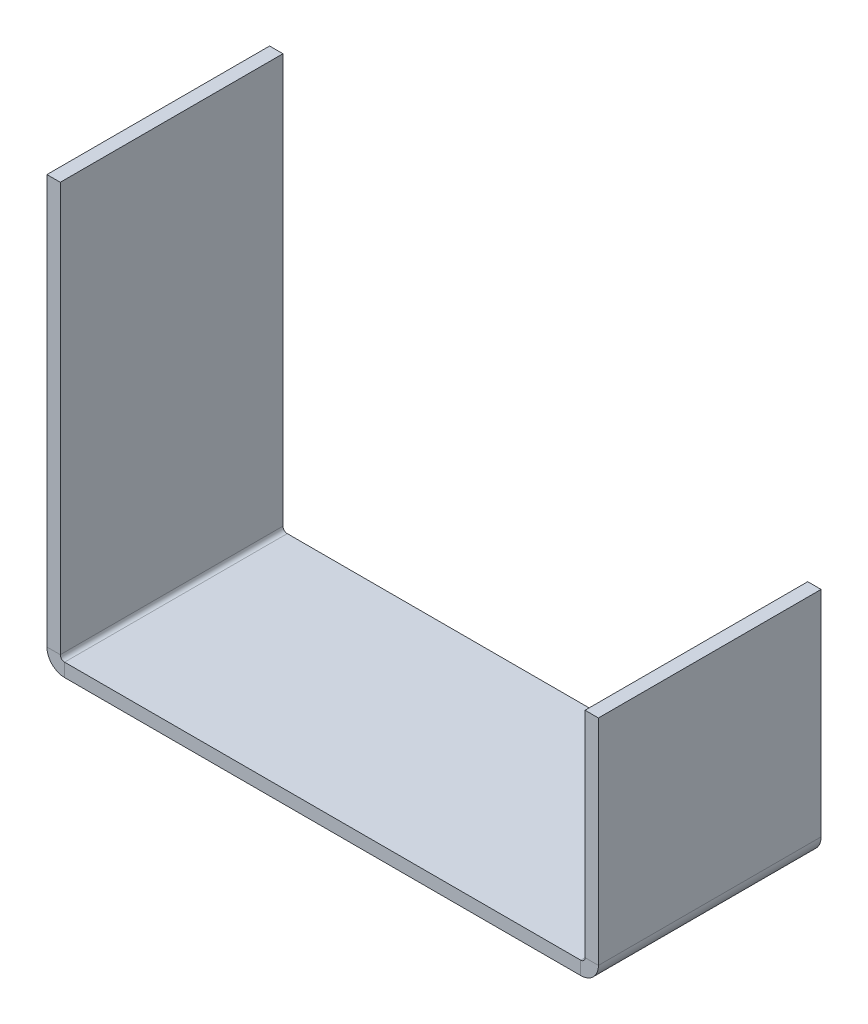
ISO-10303-21;
HEADER;
FILE_DESCRIPTION(('STEP AP214'),'2;1');
FILE_NAME('part.step','',(''),(''),'','','');
FILE_SCHEMA(('AUTOMOTIVE_DESIGN { 1 0 10303 214 1 1 1 1 }'));
ENDSEC;
DATA;
#1=APPLICATION_CONTEXT('core data for automotive mechanical design processes');
#2=APPLICATION_PROTOCOL_DEFINITION('international standard','automotive_design',2000,#1);
#3=PRODUCT_CONTEXT('',#1,'mechanical');
#4=PRODUCT('Part','Part','',(#3));
#5=PRODUCT_RELATED_PRODUCT_CATEGORY('part','',(#4));
#6=PRODUCT_DEFINITION_FORMATION('','',#4);
#7=PRODUCT_DEFINITION_CONTEXT('part definition',#1,'design');
#8=PRODUCT_DEFINITION('design','',#6,#7);
#9=PRODUCT_DEFINITION_SHAPE('','',#8);
#10=(LENGTH_UNIT() NAMED_UNIT(*) SI_UNIT(.MILLI.,.METRE.));
#11=(NAMED_UNIT(*) PLANE_ANGLE_UNIT() SI_UNIT($,.RADIAN.));
#12=(NAMED_UNIT(*) SI_UNIT($,.STERADIAN.) SOLID_ANGLE_UNIT());
#13=UNCERTAINTY_MEASURE_WITH_UNIT(LENGTH_MEASURE(1.E-05),#10,'distance_accuracy_value','');
#14=(GEOMETRIC_REPRESENTATION_CONTEXT(3) GLOBAL_UNCERTAINTY_ASSIGNED_CONTEXT((#13)) GLOBAL_UNIT_ASSIGNED_CONTEXT((#10,
#11,#12)) REPRESENTATION_CONTEXT('',''));
#15=CARTESIAN_POINT('',(0.,0.,0.));
#16=DIRECTION('',(0.,0.,1.));
#17=DIRECTION('',(1.,0.,0.));
#18=AXIS2_PLACEMENT_3D('',#15,#16,#17);
#19=CARTESIAN_POINT('',(0.,-2.286,0.));
#20=DIRECTION('',(0.,-1.,0.));
#21=DIRECTION('',(0.,0.,-1.));
#22=AXIS2_PLACEMENT_3D('',#19,#20,#21);
#23=PLANE('',#22);
#24=DIRECTION('',(1.,0.,0.));
#25=VECTOR('',#24,1.);
#26=CARTESIAN_POINT('',(-47.1805,-2.286,19.05));
#27=LINE('',#26,#25);
#28=CARTESIAN_POINT('',(-44.1579,-2.286,19.05));
#29=VERTEX_POINT('',#28);
#30=CARTESIAN_POINT('',(44.1579,-2.286,19.05));
#31=VERTEX_POINT('',#30);
#32=EDGE_CURVE('E13',#29,#31,#27,.T.);
#33=ORIENTED_EDGE('',*,*,#32,.F.);
#34=DIRECTION('',(0.,0.,1.));
#35=VECTOR('',#34,1.);
#36=CARTESIAN_POINT('',(-44.1579,-2.286,19.05));
#37=LINE('',#36,#35);
#38=CARTESIAN_POINT('',(-44.1579,-2.286,-19.05));
#39=VERTEX_POINT('',#38);
#40=EDGE_CURVE('E331',#29,#39,#37,.F.);
#41=ORIENTED_EDGE('',*,*,#40,.T.);
#42=DIRECTION('',(-1.,0.,0.));
#43=VECTOR('',#42,1.);
#44=CARTESIAN_POINT('',(-47.1805,-2.286,-19.05));
#45=LINE('',#44,#43);
#46=CARTESIAN_POINT('',(44.1579,-2.286,-19.05));
#47=VERTEX_POINT('',#46);
#48=EDGE_CURVE('E92',#47,#39,#45,.T.);
#49=ORIENTED_EDGE('',*,*,#48,.F.);
#50=DIRECTION('',(0.,0.,-1.));
#51=VECTOR('',#50,1.);
#52=CARTESIAN_POINT('',(44.1579,-2.286,-19.05));
#53=LINE('',#52,#51);
#54=EDGE_CURVE('E106',#47,#31,#53,.F.);
#55=ORIENTED_EDGE('',*,*,#54,.T.);
#56=EDGE_LOOP('',(#33,#41,#49,#55));
#57=FACE_BOUND('',#56,.T.);
#58=ADVANCED_FACE('F83',(#57),#23,.T.);
#59=CARTESIAN_POINT('',(0.,0.,0.));
#60=DIRECTION('',(0.,-1.,0.));
#61=DIRECTION('',(0.,0.,-1.));
#62=AXIS2_PLACEMENT_3D('',#59,#60,#61);
#63=PLANE('',#62);
#64=DIRECTION('',(0.,0.,1.));
#65=VECTOR('',#64,1.);
#66=CARTESIAN_POINT('',(-44.1579,0.,19.05));
#67=LINE('',#66,#65);
#68=CARTESIAN_POINT('',(-44.1579,0.,19.05));
#69=VERTEX_POINT('',#68);
#70=CARTESIAN_POINT('',(-44.1579,0.,-19.05));
#71=VERTEX_POINT('',#70);
#72=EDGE_CURVE('E201',#69,#71,#67,.F.);
#73=ORIENTED_EDGE('',*,*,#72,.F.);
#74=DIRECTION('',(1.,0.,0.));
#75=VECTOR('',#74,1.);
#76=CARTESIAN_POINT('',(-47.1805,0.,19.05));
#77=LINE('',#76,#75);
#78=CARTESIAN_POINT('',(44.1579,0.,19.05));
#79=VERTEX_POINT('',#78);
#80=EDGE_CURVE('E87',#69,#79,#77,.T.);
#81=ORIENTED_EDGE('',*,*,#80,.T.);
#82=DIRECTION('',(0.,0.,-1.));
#83=VECTOR('',#82,1.);
#84=CARTESIAN_POINT('',(44.1579,0.,-19.05));
#85=LINE('',#84,#83);
#86=CARTESIAN_POINT('',(44.1579,0.,-19.05));
#87=VERTEX_POINT('',#86);
#88=EDGE_CURVE('E150',#87,#79,#85,.F.);
#89=ORIENTED_EDGE('',*,*,#88,.F.);
#90=DIRECTION('',(-1.,0.,0.));
#91=VECTOR('',#90,1.);
#92=CARTESIAN_POINT('',(-47.1805,0.,-19.05));
#93=LINE('',#92,#91);
#94=EDGE_CURVE('E189',#87,#71,#93,.T.);
#95=ORIENTED_EDGE('',*,*,#94,.T.);
#96=EDGE_LOOP('',(#73,#81,#89,#95));
#97=FACE_BOUND('',#96,.T.);
#98=ADVANCED_FACE('F198',(#97),#63,.F.);
#99=CARTESIAN_POINT('',(-47.1805,-2.286,19.05));
#100=DIRECTION('',(0.,0.,1.));
#101=DIRECTION('',(1.,0.,0.));
#102=AXIS2_PLACEMENT_3D('',#99,#100,#101);
#103=PLANE('',#102);
#104=ORIENTED_EDGE('',*,*,#80,.F.);
#105=DIRECTION('',(0.,-1.,0.));
#106=VECTOR('',#105,1.);
#107=CARTESIAN_POINT('',(-44.1579,0.,19.05));
#108=LINE('',#107,#106);
#109=EDGE_CURVE('E337',#69,#29,#108,.T.);
#110=ORIENTED_EDGE('',*,*,#109,.T.);
#111=ORIENTED_EDGE('',*,*,#32,.T.);
#112=DIRECTION('',(0.,-1.,0.));
#113=VECTOR('',#112,1.);
#114=CARTESIAN_POINT('',(44.1579,0.,19.05));
#115=LINE('',#114,#113);
#116=EDGE_CURVE('E186',#79,#31,#115,.T.);
#117=ORIENTED_EDGE('',*,*,#116,.F.);
#118=EDGE_LOOP('',(#104,#110,#111,#117));
#119=FACE_BOUND('',#118,.T.);
#120=ADVANCED_FACE('F204',(#119),#103,.T.);
#121=CARTESIAN_POINT('',(-47.1805,-2.286,-19.05));
#122=DIRECTION('',(0.,0.,-1.));
#123=DIRECTION('',(-1.,0.,0.));
#124=AXIS2_PLACEMENT_3D('',#121,#122,#123);
#125=PLANE('',#124);
#126=DIRECTION('',(0.,-1.,0.));
#127=VECTOR('',#126,1.);
#128=CARTESIAN_POINT('',(-44.1579,0.,-19.05));
#129=LINE('',#128,#127);
#130=EDGE_CURVE('E177',#71,#39,#129,.T.);
#131=ORIENTED_EDGE('',*,*,#130,.F.);
#132=ORIENTED_EDGE('',*,*,#94,.F.);
#133=DIRECTION('',(0.,-1.,0.));
#134=VECTOR('',#133,1.);
#135=CARTESIAN_POINT('',(44.1579,0.,-19.05));
#136=LINE('',#135,#134);
#137=EDGE_CURVE('E149',#87,#47,#136,.T.);
#138=ORIENTED_EDGE('',*,*,#137,.T.);
#139=ORIENTED_EDGE('',*,*,#48,.T.);
#140=EDGE_LOOP('',(#131,#132,#138,#139));
#141=FACE_BOUND('',#140,.T.);
#142=ADVANCED_FACE('F85',(#141),#125,.T.);
#143=CARTESIAN_POINT('',(44.1579,0.7366,19.05));
#144=DIRECTION('',(0.,0.,1.));
#145=DIRECTION('',(1.,0.,0.));
#146=AXIS2_PLACEMENT_3D('',#143,#144,#145);
#147=PLANE('',#146);
#148=DIRECTION('',(-1.,0.,0.));
#149=VECTOR('',#148,1.);
#150=CARTESIAN_POINT('',(47.1805,0.736599999999989,19.05));
#151=LINE('',#150,#149);
#152=CARTESIAN_POINT('',(44.8945,0.736599999999997,19.05));
#153=VERTEX_POINT('',#152);
#154=CARTESIAN_POINT('',(47.1805,0.736599999999989,19.05));
#155=VERTEX_POINT('',#154);
#156=EDGE_CURVE('E140',#153,#155,#151,.F.);
#157=ORIENTED_EDGE('',*,*,#156,.F.);
#158=CARTESIAN_POINT('',(44.1579,0.7366,19.05));
#159=DIRECTION('',(0.,0.,-1.));
#160=DIRECTION('',(-1.,0.,0.));
#161=AXIS2_PLACEMENT_3D('',#158,#159,#160);
#162=CIRCLE('',#161,0.736599999999997);
#163=EDGE_CURVE('E134',#79,#153,#162,.F.);
#164=ORIENTED_EDGE('',*,*,#163,.F.);
#165=ORIENTED_EDGE('',*,*,#116,.T.);
#166=CARTESIAN_POINT('',(44.1579,0.7366,19.05));
#167=DIRECTION('',(0.,0.,-1.));
#168=DIRECTION('',(-1.,0.,0.));
#169=AXIS2_PLACEMENT_3D('',#166,#167,#168);
#170=CIRCLE('',#169,3.0226);
#171=EDGE_CURVE('E179',#31,#155,#170,.F.);
#172=ORIENTED_EDGE('',*,*,#171,.T.);
#173=EDGE_LOOP('',(#157,#164,#165,#172));
#174=FACE_BOUND('',#173,.T.);
#175=ADVANCED_FACE('F203',(#174),#147,.T.);
#176=CARTESIAN_POINT('',(44.1579,0.7366,-19.05));
#177=DIRECTION('',(0.,0.,1.));
#178=DIRECTION('',(1.,0.,0.));
#179=AXIS2_PLACEMENT_3D('',#176,#177,#178);
#180=PLANE('',#179);
#181=CARTESIAN_POINT('',(44.1579,0.7366,-19.05));
#182=DIRECTION('',(0.,0.,-1.));
#183=DIRECTION('',(-1.,0.,0.));
#184=AXIS2_PLACEMENT_3D('',#181,#182,#183);
#185=CIRCLE('',#184,0.736599999999997);
#186=CARTESIAN_POINT('',(44.8945,0.736599999999997,-19.05));
#187=VERTEX_POINT('',#186);
#188=EDGE_CURVE('E131',#187,#87,#185,.T.);
#189=ORIENTED_EDGE('',*,*,#188,.F.);
#190=DIRECTION('',(-1.,0.,0.));
#191=VECTOR('',#190,1.);
#192=CARTESIAN_POINT('',(44.8945,0.736599999999997,-19.05));
#193=LINE('',#192,#191);
#194=CARTESIAN_POINT('',(47.1805,0.736599999999989,-19.05));
#195=VERTEX_POINT('',#194);
#196=EDGE_CURVE('E139',#187,#195,#193,.F.);
#197=ORIENTED_EDGE('',*,*,#196,.T.);
#198=CARTESIAN_POINT('',(44.1579,0.7366,-19.05));
#199=DIRECTION('',(0.,0.,-1.));
#200=DIRECTION('',(-1.,0.,0.));
#201=AXIS2_PLACEMENT_3D('',#198,#199,#200);
#202=CIRCLE('',#201,3.0226);
#203=EDGE_CURVE('E180',#195,#47,#202,.T.);
#204=ORIENTED_EDGE('',*,*,#203,.T.);
#205=ORIENTED_EDGE('',*,*,#137,.F.);
#206=EDGE_LOOP('',(#189,#197,#204,#205));
#207=FACE_BOUND('',#206,.T.);
#208=ADVANCED_FACE('F145',(#207),#180,.F.);
#209=CARTESIAN_POINT('',(44.1579,0.7366,-19.05));
#210=DIRECTION('',(0.,0.,-1.));
#211=DIRECTION('',(1.,0.,0.));
#212=AXIS2_PLACEMENT_3D('',#209,#210,#211);
#213=CYLINDRICAL_SURFACE('',#212,3.0226);
#214=ORIENTED_EDGE('',*,*,#54,.F.);
#215=ORIENTED_EDGE('',*,*,#203,.F.);
#216=DIRECTION('',(0.,0.,-1.));
#217=VECTOR('',#216,1.);
#218=CARTESIAN_POINT('',(47.1805,0.736599999999989,19.05));
#219=LINE('',#218,#217);
#220=EDGE_CURVE('E163',#195,#155,#219,.F.);
#221=ORIENTED_EDGE('',*,*,#220,.T.);
#222=ORIENTED_EDGE('',*,*,#171,.F.);
#223=EDGE_LOOP('',(#214,#215,#221,#222));
#224=FACE_BOUND('',#223,.T.);
#225=ADVANCED_FACE('F220',(#224),#213,.T.);
#226=CARTESIAN_POINT('',(44.1579,0.7366,-19.05));
#227=DIRECTION('',(0.,0.,-1.));
#228=DIRECTION('',(1.,0.,0.));
#229=AXIS2_PLACEMENT_3D('',#226,#227,#228);
#230=CYLINDRICAL_SURFACE('',#229,0.736599999999997);
#231=ORIENTED_EDGE('',*,*,#88,.T.);
#232=ORIENTED_EDGE('',*,*,#163,.T.);
#233=DIRECTION('',(0.,0.,-1.));
#234=VECTOR('',#233,1.);
#235=CARTESIAN_POINT('',(44.8945,0.736599999999997,19.05));
#236=LINE('',#235,#234);
#237=EDGE_CURVE('E127',#153,#187,#236,.T.);
#238=ORIENTED_EDGE('',*,*,#237,.T.);
#239=ORIENTED_EDGE('',*,*,#188,.T.);
#240=EDGE_LOOP('',(#231,#232,#238,#239));
#241=FACE_BOUND('',#240,.T.);
#242=ADVANCED_FACE('F130',(#241),#230,.F.);
#243=CARTESIAN_POINT('',(47.1805000000002,37.4015,-19.05));
#244=DIRECTION('',(0.,0.,1.));
#245=DIRECTION('',(0.,-1.,0.));
#246=AXIS2_PLACEMENT_3D('',#243,#244,#245);
#247=PLANE('',#246);
#248=ORIENTED_EDGE('',*,*,#196,.F.);
#249=DIRECTION('',(0.,-1.,0.));
#250=VECTOR('',#249,1.);
#251=CARTESIAN_POINT('',(44.8945000000001,37.4015,-19.05));
#252=LINE('',#251,#250);
#253=CARTESIAN_POINT('',(44.8945000000001,37.4015,-19.05));
#254=VERTEX_POINT('',#253);
#255=EDGE_CURVE('E159',#187,#254,#252,.F.);
#256=ORIENTED_EDGE('',*,*,#255,.T.);
#257=DIRECTION('',(-1.,0.,0.));
#258=VECTOR('',#257,1.);
#259=CARTESIAN_POINT('',(47.1805000000002,37.4015,-19.05));
#260=LINE('',#259,#258);
#261=CARTESIAN_POINT('',(47.1805000000001,37.4015,-19.05));
#262=VERTEX_POINT('',#261);
#263=EDGE_CURVE('E151',#262,#254,#260,.T.);
#264=ORIENTED_EDGE('',*,*,#263,.F.);
#265=DIRECTION('',(0.,1.,0.));
#266=VECTOR('',#265,1.);
#267=CARTESIAN_POINT('',(47.1805,-1.70756903369944E-13,-19.05));
#268=LINE('',#267,#266);
#269=EDGE_CURVE('E162',#195,#262,#268,.T.);
#270=ORIENTED_EDGE('',*,*,#269,.F.);
#271=EDGE_LOOP('',(#248,#256,#264,#270));
#272=FACE_BOUND('',#271,.T.);
#273=ADVANCED_FACE('F156',(#272),#247,.F.);
#274=CARTESIAN_POINT('',(47.1805,0.,19.05));
#275=DIRECTION('',(0.,0.,-1.));
#276=DIRECTION('',(-1.,0.,0.));
#277=AXIS2_PLACEMENT_3D('',#274,#275,#276);
#278=PLANE('',#277);
#279=ORIENTED_EDGE('',*,*,#156,.T.);
#280=DIRECTION('',(0.,-1.,0.));
#281=VECTOR('',#280,1.);
#282=CARTESIAN_POINT('',(47.1805,-1.74291144747146E-13,19.05));
#283=LINE('',#282,#281);
#284=CARTESIAN_POINT('',(47.1805000000001,37.4015,19.05));
#285=VERTEX_POINT('',#284);
#286=EDGE_CURVE('E354',#285,#155,#283,.T.);
#287=ORIENTED_EDGE('',*,*,#286,.F.);
#288=DIRECTION('',(-1.,0.,0.));
#289=VECTOR('',#288,1.);
#290=CARTESIAN_POINT('',(47.1805000000001,37.4015,19.05));
#291=LINE('',#290,#289);
#292=CARTESIAN_POINT('',(44.8945000000001,37.4015,19.05));
#293=VERTEX_POINT('',#292);
#294=EDGE_CURVE('E351',#285,#293,#291,.T.);
#295=ORIENTED_EDGE('',*,*,#294,.T.);
#296=DIRECTION('',(0.,1.,0.));
#297=VECTOR('',#296,1.);
#298=CARTESIAN_POINT('',(44.8945,0.,19.05));
#299=LINE('',#298,#297);
#300=EDGE_CURVE('E170',#293,#153,#299,.F.);
#301=ORIENTED_EDGE('',*,*,#300,.T.);
#302=EDGE_LOOP('',(#279,#287,#295,#301));
#303=FACE_BOUND('',#302,.T.);
#304=ADVANCED_FACE('F229',(#303),#278,.F.);
#305=CARTESIAN_POINT('',(47.1805,-1.74291144747146E-13,0.));
#306=DIRECTION('',(-1.,0.,0.));
#307=DIRECTION('',(0.,-1.,0.));
#308=AXIS2_PLACEMENT_3D('',#305,#306,#307);
#309=PLANE('',#308);
#310=ORIENTED_EDGE('',*,*,#220,.F.);
#311=ORIENTED_EDGE('',*,*,#269,.T.);
#312=DIRECTION('',(0.,0.,1.));
#313=VECTOR('',#312,1.);
#314=CARTESIAN_POINT('',(47.1805000000001,37.4015,0.));
#315=LINE('',#314,#313);
#316=EDGE_CURVE('E357',#262,#285,#315,.T.);
#317=ORIENTED_EDGE('',*,*,#316,.T.);
#318=ORIENTED_EDGE('',*,*,#286,.T.);
#319=EDGE_LOOP('',(#310,#311,#317,#318));
#320=FACE_BOUND('',#319,.T.);
#321=ADVANCED_FACE('F237',(#320),#309,.F.);
#322=CARTESIAN_POINT('',(44.8945,-1.66309618406551E-13,0.));
#323=DIRECTION('',(-1.,0.,0.));
#324=DIRECTION('',(0.,-1.,0.));
#325=AXIS2_PLACEMENT_3D('',#322,#323,#324);
#326=PLANE('',#325);
#327=ORIENTED_EDGE('',*,*,#255,.F.);
#328=ORIENTED_EDGE('',*,*,#237,.F.);
#329=ORIENTED_EDGE('',*,*,#300,.F.);
#330=DIRECTION('',(0.,0.,-1.));
#331=VECTOR('',#330,1.);
#332=CARTESIAN_POINT('',(44.8945000000001,37.4015,19.05));
#333=LINE('',#332,#331);
#334=EDGE_CURVE('E168',#254,#293,#333,.F.);
#335=ORIENTED_EDGE('',*,*,#334,.F.);
#336=EDGE_LOOP('',(#327,#328,#329,#335));
#337=FACE_BOUND('',#336,.T.);
#338=ADVANCED_FACE('F166',(#337),#326,.T.);
#339=CARTESIAN_POINT('',(47.1805000000002,37.4015,19.05));
#340=DIRECTION('',(0.,-1.,0.));
#341=DIRECTION('',(1.,0.,0.));
#342=AXIS2_PLACEMENT_3D('',#339,#340,#341);
#343=PLANE('',#342);
#344=ORIENTED_EDGE('',*,*,#334,.T.);
#345=ORIENTED_EDGE('',*,*,#294,.F.);
#346=ORIENTED_EDGE('',*,*,#316,.F.);
#347=ORIENTED_EDGE('',*,*,#263,.T.);
#348=EDGE_LOOP('',(#344,#345,#346,#347));
#349=FACE_BOUND('',#348,.T.);
#350=ADVANCED_FACE('F230',(#349),#343,.F.);
#351=CARTESIAN_POINT('',(-44.1579,0.7366,-19.05));
#352=DIRECTION('',(0.,0.,-1.));
#353=DIRECTION('',(-1.,0.,0.));
#354=AXIS2_PLACEMENT_3D('',#351,#352,#353);
#355=PLANE('',#354);
#356=DIRECTION('',(1.,0.,0.));
#357=VECTOR('',#356,1.);
#358=CARTESIAN_POINT('',(-47.1805,0.736599999999989,-19.05));
#359=LINE('',#358,#357);
#360=CARTESIAN_POINT('',(-44.8945,0.736599999999997,-19.05));
#361=VERTEX_POINT('',#360);
#362=CARTESIAN_POINT('',(-47.1805,0.736599999999989,-19.05));
#363=VERTEX_POINT('',#362);
#364=EDGE_CURVE('E328',#361,#363,#359,.F.);
#365=ORIENTED_EDGE('',*,*,#364,.F.);
#366=CARTESIAN_POINT('',(-44.1579,0.7366,-19.05));
#367=DIRECTION('',(0.,0.,1.));
#368=DIRECTION('',(1.,0.,0.));
#369=AXIS2_PLACEMENT_3D('',#366,#367,#368);
#370=CIRCLE('',#369,0.736599999999997);
#371=EDGE_CURVE('E340',#71,#361,#370,.F.);
#372=ORIENTED_EDGE('',*,*,#371,.F.);
#373=ORIENTED_EDGE('',*,*,#130,.T.);
#374=CARTESIAN_POINT('',(-44.1579,0.7366,-19.05));
#375=DIRECTION('',(0.,0.,1.));
#376=DIRECTION('',(1.,0.,0.));
#377=AXIS2_PLACEMENT_3D('',#374,#375,#376);
#378=CIRCLE('',#377,3.0226);
#379=EDGE_CURVE('E334',#39,#363,#378,.F.);
#380=ORIENTED_EDGE('',*,*,#379,.T.);
#381=EDGE_LOOP('',(#365,#372,#373,#380));
#382=FACE_BOUND('',#381,.T.);
#383=ADVANCED_FACE('F233',(#382),#355,.T.);
#384=CARTESIAN_POINT('',(-44.1579,0.7366,19.05));
#385=DIRECTION('',(0.,0.,-1.));
#386=DIRECTION('',(-1.,0.,0.));
#387=AXIS2_PLACEMENT_3D('',#384,#385,#386);
#388=PLANE('',#387);
#389=CARTESIAN_POINT('',(-44.1579,0.7366,19.05));
#390=DIRECTION('',(0.,0.,1.));
#391=DIRECTION('',(1.,0.,0.));
#392=AXIS2_PLACEMENT_3D('',#389,#390,#391);
#393=CIRCLE('',#392,0.736599999999997);
#394=CARTESIAN_POINT('',(-44.8945,0.736599999999997,19.05));
#395=VERTEX_POINT('',#394);
#396=EDGE_CURVE('E344',#395,#69,#393,.T.);
#397=ORIENTED_EDGE('',*,*,#396,.F.);
#398=DIRECTION('',(1.,0.,0.));
#399=VECTOR('',#398,1.);
#400=CARTESIAN_POINT('',(-44.8945,0.736599999999997,19.05));
#401=LINE('',#400,#399);
#402=CARTESIAN_POINT('',(-47.1805,0.736599999999989,19.05));
#403=VERTEX_POINT('',#402);
#404=EDGE_CURVE('E300',#395,#403,#401,.F.);
#405=ORIENTED_EDGE('',*,*,#404,.T.);
#406=CARTESIAN_POINT('',(-44.1579,0.7366,19.05));
#407=DIRECTION('',(0.,0.,1.));
#408=DIRECTION('',(1.,0.,0.));
#409=AXIS2_PLACEMENT_3D('',#406,#407,#408);
#410=CIRCLE('',#409,3.0226);
#411=EDGE_CURVE('E335',#403,#29,#410,.T.);
#412=ORIENTED_EDGE('',*,*,#411,.T.);
#413=ORIENTED_EDGE('',*,*,#109,.F.);
#414=EDGE_LOOP('',(#397,#405,#412,#413));
#415=FACE_BOUND('',#414,.T.);
#416=ADVANCED_FACE('F244',(#415),#388,.F.);
#417=CARTESIAN_POINT('',(-44.1579,0.7366,19.05));
#418=DIRECTION('',(0.,0.,1.));
#419=DIRECTION('',(-1.,0.,0.));
#420=AXIS2_PLACEMENT_3D('',#417,#418,#419);
#421=CYLINDRICAL_SURFACE('',#420,3.0226);
#422=ORIENTED_EDGE('',*,*,#40,.F.);
#423=ORIENTED_EDGE('',*,*,#411,.F.);
#424=DIRECTION('',(0.,0.,1.));
#425=VECTOR('',#424,1.);
#426=CARTESIAN_POINT('',(-47.1805,0.736599999999989,-19.05));
#427=LINE('',#426,#425);
#428=EDGE_CURVE('E285',#403,#363,#427,.F.);
#429=ORIENTED_EDGE('',*,*,#428,.T.);
#430=ORIENTED_EDGE('',*,*,#379,.F.);
#431=EDGE_LOOP('',(#422,#423,#429,#430));
#432=FACE_BOUND('',#431,.T.);
#433=ADVANCED_FACE('F247',(#432),#421,.T.);
#434=CARTESIAN_POINT('',(-44.1579,0.7366,19.05));
#435=DIRECTION('',(0.,0.,1.));
#436=DIRECTION('',(-1.,0.,0.));
#437=AXIS2_PLACEMENT_3D('',#434,#435,#436);
#438=CYLINDRICAL_SURFACE('',#437,0.736599999999997);
#439=ORIENTED_EDGE('',*,*,#72,.T.);
#440=ORIENTED_EDGE('',*,*,#371,.T.);
#441=DIRECTION('',(0.,0.,1.));
#442=VECTOR('',#441,1.);
#443=CARTESIAN_POINT('',(-44.8945,0.736599999999997,-19.05));
#444=LINE('',#443,#442);
#445=EDGE_CURVE('E325',#361,#395,#444,.T.);
#446=ORIENTED_EDGE('',*,*,#445,.T.);
#447=ORIENTED_EDGE('',*,*,#396,.T.);
#448=EDGE_LOOP('',(#439,#440,#446,#447));
#449=FACE_BOUND('',#448,.T.);
#450=ADVANCED_FACE('F252',(#449),#438,.F.);
#451=CARTESIAN_POINT('',(-47.1805,0.,-19.05));
#452=DIRECTION('',(0.,0.,1.));
#453=DIRECTION('',(1.,0.,0.));
#454=AXIS2_PLACEMENT_3D('',#451,#452,#453);
#455=PLANE('',#454);
#456=ORIENTED_EDGE('',*,*,#364,.T.);
#457=DIRECTION('',(0.,-1.,0.));
#458=VECTOR('',#457,1.);
#459=CARTESIAN_POINT('',(-47.1805,-1.74589725749671E-13,-19.05));
#460=LINE('',#459,#458);
#461=CARTESIAN_POINT('',(-47.1805000000002,70.739,-19.05));
#462=VERTEX_POINT('',#461);
#463=EDGE_CURVE('E293',#462,#363,#460,.T.);
#464=ORIENTED_EDGE('',*,*,#463,.F.);
#465=DIRECTION('',(1.,0.,0.));
#466=VECTOR('',#465,1.);
#467=CARTESIAN_POINT('',(-47.1805000000002,70.739,-19.05));
#468=LINE('',#467,#466);
#469=CARTESIAN_POINT('',(-44.8945000000002,70.739,-19.05));
#470=VERTEX_POINT('',#469);
#471=EDGE_CURVE('E312',#462,#470,#468,.T.);
#472=ORIENTED_EDGE('',*,*,#471,.T.);
#473=DIRECTION('',(0.,1.,0.));
#474=VECTOR('',#473,1.);
#475=CARTESIAN_POINT('',(-44.8945,0.,-19.05));
#476=LINE('',#475,#474);
#477=EDGE_CURVE('E299',#470,#361,#476,.F.);
#478=ORIENTED_EDGE('',*,*,#477,.T.);
#479=EDGE_LOOP('',(#456,#464,#472,#478));
#480=FACE_BOUND('',#479,.T.);
#481=ADVANCED_FACE('F255',(#480),#455,.F.);
#482=CARTESIAN_POINT('',(-47.1805000000002,70.739,19.05));
#483=DIRECTION('',(0.,0.,-1.));
#484=DIRECTION('',(0.,1.,0.));
#485=AXIS2_PLACEMENT_3D('',#482,#483,#484);
#486=PLANE('',#485);
#487=ORIENTED_EDGE('',*,*,#404,.F.);
#488=DIRECTION('',(0.,-1.,0.));
#489=VECTOR('',#488,1.);
#490=CARTESIAN_POINT('',(-44.8945000000002,70.739,19.05));
#491=LINE('',#490,#489);
#492=CARTESIAN_POINT('',(-44.8945000000002,70.739,19.05));
#493=VERTEX_POINT('',#492);
#494=EDGE_CURVE('E320',#395,#493,#491,.F.);
#495=ORIENTED_EDGE('',*,*,#494,.T.);
#496=DIRECTION('',(1.,0.,0.));
#497=VECTOR('',#496,1.);
#498=CARTESIAN_POINT('',(-47.1805000000002,70.739,19.05));
#499=LINE('',#498,#497);
#500=CARTESIAN_POINT('',(-47.1805000000002,70.739,19.05));
#501=VERTEX_POINT('',#500);
#502=EDGE_CURVE('E308',#501,#493,#499,.T.);
#503=ORIENTED_EDGE('',*,*,#502,.F.);
#504=DIRECTION('',(0.,1.,0.));
#505=VECTOR('',#504,1.);
#506=CARTESIAN_POINT('',(-47.1805,-1.72721082867111E-13,19.05));
#507=LINE('',#506,#505);
#508=EDGE_CURVE('E289',#403,#501,#507,.T.);
#509=ORIENTED_EDGE('',*,*,#508,.F.);
#510=EDGE_LOOP('',(#487,#495,#503,#509));
#511=FACE_BOUND('',#510,.T.);
#512=ADVANCED_FACE('F262',(#511),#486,.F.);
#513=CARTESIAN_POINT('',(-47.1805,-1.74589725749671E-13,0.));
#514=DIRECTION('',(1.,0.,0.));
#515=DIRECTION('',(0.,1.,0.));
#516=AXIS2_PLACEMENT_3D('',#513,#514,#515);
#517=PLANE('',#516);
#518=ORIENTED_EDGE('',*,*,#428,.F.);
#519=ORIENTED_EDGE('',*,*,#508,.T.);
#520=DIRECTION('',(0.,0.,-1.));
#521=VECTOR('',#520,1.);
#522=CARTESIAN_POINT('',(-47.1805000000002,70.739,0.));
#523=LINE('',#522,#521);
#524=EDGE_CURVE('E310',#501,#462,#523,.T.);
#525=ORIENTED_EDGE('',*,*,#524,.T.);
#526=ORIENTED_EDGE('',*,*,#463,.T.);
#527=EDGE_LOOP('',(#518,#519,#525,#526));
#528=FACE_BOUND('',#527,.T.);
#529=ADVANCED_FACE('F266',(#528),#517,.F.);
#530=CARTESIAN_POINT('',(-44.8945,-1.66608199409076E-13,0.));
#531=DIRECTION('',(1.,0.,0.));
#532=DIRECTION('',(0.,1.,0.));
#533=AXIS2_PLACEMENT_3D('',#530,#531,#532);
#534=PLANE('',#533);
#535=ORIENTED_EDGE('',*,*,#494,.F.);
#536=ORIENTED_EDGE('',*,*,#445,.F.);
#537=ORIENTED_EDGE('',*,*,#477,.F.);
#538=DIRECTION('',(0.,0.,1.));
#539=VECTOR('',#538,1.);
#540=CARTESIAN_POINT('',(-44.8945000000002,70.739,-19.05));
#541=LINE('',#540,#539);
#542=EDGE_CURVE('E314',#493,#470,#541,.F.);
#543=ORIENTED_EDGE('',*,*,#542,.F.);
#544=EDGE_LOOP('',(#535,#536,#537,#543));
#545=FACE_BOUND('',#544,.T.);
#546=ADVANCED_FACE('F271',(#545),#534,.T.);
#547=CARTESIAN_POINT('',(-47.1805000000002,70.739,-19.05));
#548=DIRECTION('',(0.,-1.,0.));
#549=DIRECTION('',(1.,0.,0.));
#550=AXIS2_PLACEMENT_3D('',#547,#548,#549);
#551=PLANE('',#550);
#552=ORIENTED_EDGE('',*,*,#542,.T.);
#553=ORIENTED_EDGE('',*,*,#471,.F.);
#554=ORIENTED_EDGE('',*,*,#524,.F.);
#555=ORIENTED_EDGE('',*,*,#502,.T.);
#556=EDGE_LOOP('',(#552,#553,#554,#555));
#557=FACE_BOUND('',#556,.T.);
#558=ADVANCED_FACE('F268',(#557),#551,.F.);
#559=CLOSED_SHELL('',(#58,#98,#120,#142,#175,#208,#225,#242,#273,#304,#321,#338,#350,#383,#416,
#433,#450,#481,#512,#529,#546,#558));
#560=MANIFOLD_SOLID_BREP('B2',#559);
#561=ADVANCED_BREP_SHAPE_REPRESENTATION('',(#18,#560),#14);
#562=SHAPE_DEFINITION_REPRESENTATION(#9,#561);
ENDSEC;
END-ISO-10303-21;
